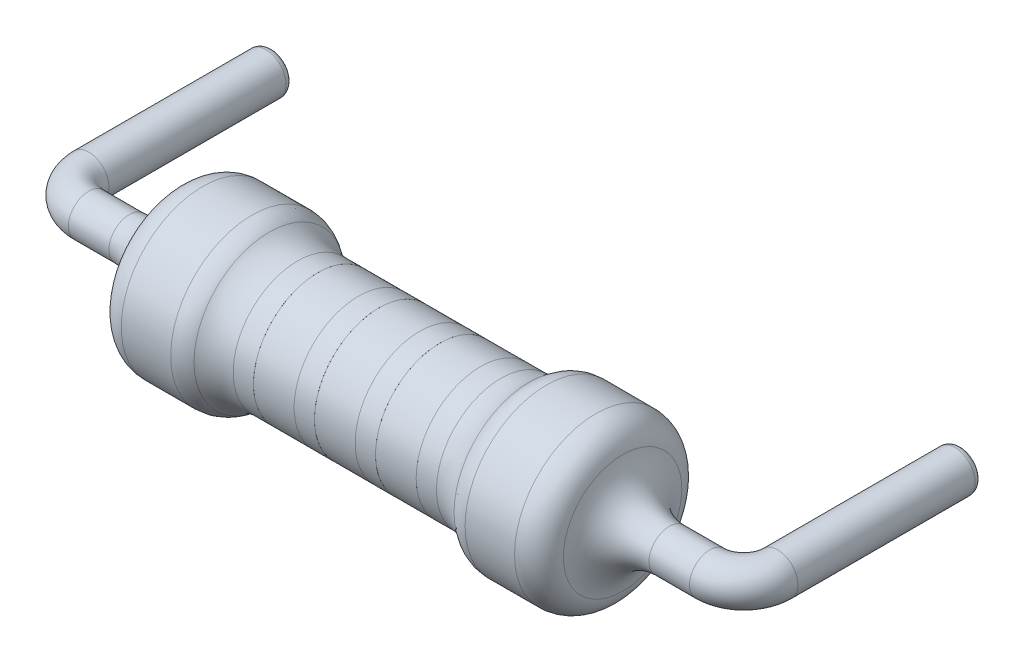
ISO-10303-21;
HEADER;
FILE_DESCRIPTION(('STEP AP214'),'2;1');
FILE_NAME('part.step','',(''),(''),'','','');
FILE_SCHEMA(('AUTOMOTIVE_DESIGN { 1 0 10303 214 1 1 1 1 }'));
ENDSEC;
DATA;
#1=APPLICATION_CONTEXT('core data for automotive mechanical design processes');
#2=APPLICATION_PROTOCOL_DEFINITION('international standard','automotive_design',2000,#1);
#3=PRODUCT_CONTEXT('',#1,'mechanical');
#4=PRODUCT('Part','Part','',(#3));
#5=PRODUCT_RELATED_PRODUCT_CATEGORY('part','',(#4));
#6=PRODUCT_DEFINITION_FORMATION('','',#4);
#7=PRODUCT_DEFINITION_CONTEXT('part definition',#1,'design');
#8=PRODUCT_DEFINITION('design','',#6,#7);
#9=PRODUCT_DEFINITION_SHAPE('','',#8);
#10=(LENGTH_UNIT() NAMED_UNIT(*) SI_UNIT(.MILLI.,.METRE.));
#11=(NAMED_UNIT(*) PLANE_ANGLE_UNIT() SI_UNIT($,.RADIAN.));
#12=(NAMED_UNIT(*) SI_UNIT($,.STERADIAN.) SOLID_ANGLE_UNIT());
#13=UNCERTAINTY_MEASURE_WITH_UNIT(LENGTH_MEASURE(1.E-05),#10,'distance_accuracy_value','');
#14=(GEOMETRIC_REPRESENTATION_CONTEXT(3) GLOBAL_UNCERTAINTY_ASSIGNED_CONTEXT((#13)) GLOBAL_UNIT_ASSIGNED_CONTEXT((#10,
#11,#12)) REPRESENTATION_CONTEXT('',''));
#15=CARTESIAN_POINT('',(0.,0.,0.));
#16=DIRECTION('',(0.,0.,1.));
#17=DIRECTION('',(1.,0.,0.));
#18=AXIS2_PLACEMENT_3D('',#15,#16,#17);
#19=CARTESIAN_POINT('',(4.48700576850888,0.,1.213));
#20=DIRECTION('',(-1.,0.,0.));
#21=DIRECTION('',(0.,0.,1.));
#22=AXIS2_PLACEMENT_3D('',#19,#20,#21);
#23=CYLINDRICAL_SURFACE('',#22,0.95);
#24=CARTESIAN_POINT('',(0.6,0.,1.213));
#25=DIRECTION('',(1.,0.,0.));
#26=DIRECTION('',(0.,0.,-1.));
#27=AXIS2_PLACEMENT_3D('',#24,#25,#26);
#28=CIRCLE('',#27,0.95);
#29=CARTESIAN_POINT('',(0.6,0.,0.262999999999996));
#30=VERTEX_POINT('',#29);
#31=EDGE_CURVE('E92',#30,#30,#28,.T.);
#32=ORIENTED_EDGE('',*,*,#31,.T.);
#33=EDGE_LOOP('',(#32));
#34=FACE_BOUND('',#33,.T.);
#35=CARTESIAN_POINT('',(1.2,0.,1.213));
#36=DIRECTION('',(1.,0.,0.));
#37=DIRECTION('',(0.,0.,-1.));
#38=AXIS2_PLACEMENT_3D('',#35,#36,#37);
#39=CIRCLE('',#38,0.95);
#40=CARTESIAN_POINT('',(1.2,0.,0.262999999999996));
#41=VERTEX_POINT('',#40);
#42=EDGE_CURVE('E67',#41,#41,#39,.T.);
#43=ORIENTED_EDGE('',*,*,#42,.F.);
#44=EDGE_LOOP('',(#43));
#45=FACE_BOUND('',#44,.T.);
#46=ADVANCED_FACE('F54',(#34,#45),#23,.T.);
#47=CARTESIAN_POINT('',(1.2,0.,1.213));
#48=DIRECTION('',(1.,0.,0.));
#49=DIRECTION('',(0.,0.,-1.));
#50=AXIS2_PLACEMENT_3D('',#47,#48,#49);
#51=PLANE('',#50);
#52=CARTESIAN_POINT('',(1.2,0.,1.213));
#53=DIRECTION('',(1.,0.,0.));
#54=DIRECTION('',(0.,0.,-1.));
#55=AXIS2_PLACEMENT_3D('',#52,#53,#54);
#56=CIRCLE('',#55,0.9505);
#57=CARTESIAN_POINT('',(1.2,0.,0.262499999999996));
#58=VERTEX_POINT('',#57);
#59=EDGE_CURVE('E96',#58,#58,#56,.T.);
#60=ORIENTED_EDGE('',*,*,#59,.F.);
#61=EDGE_LOOP('',(#60));
#62=FACE_BOUND('',#61,.T.);
#63=ORIENTED_EDGE('',*,*,#42,.T.);
#64=EDGE_LOOP('',(#63));
#65=FACE_BOUND('',#64,.T.);
#66=ADVANCED_FACE('F178',(#62,#65),#51,.F.);
#67=CARTESIAN_POINT('',(1.5,0.,1.213));
#68=DIRECTION('',(-1.,0.,0.));
#69=DIRECTION('',(0.,0.,1.));
#70=AXIS2_PLACEMENT_3D('',#67,#68,#69);
#71=CYLINDRICAL_SURFACE('',#70,0.9505);
#72=ORIENTED_EDGE('',*,*,#59,.T.);
#73=EDGE_LOOP('',(#72));
#74=FACE_BOUND('',#73,.T.);
#75=CARTESIAN_POINT('',(1.49905071029915,0.,1.213));
#76=DIRECTION('',(-1.,0.,0.));
#77=DIRECTION('',(0.,0.,1.));
#78=AXIS2_PLACEMENT_3D('',#75,#76,#77);
#79=CIRCLE('',#78,0.9505);
#80=CARTESIAN_POINT('',(1.49905071029915,0.,2.1635));
#81=VERTEX_POINT('',#80);
#82=EDGE_CURVE('E153',#81,#81,#79,.T.);
#83=ORIENTED_EDGE('',*,*,#82,.T.);
#84=EDGE_LOOP('',(#83));
#85=FACE_BOUND('',#84,.T.);
#86=ADVANCED_FACE('F185',(#74,#85),#71,.T.);
#87=CARTESIAN_POINT('',(5.08,0.,-2.00000000000004));
#88=DIRECTION('',(0.,0.,-1.));
#89=DIRECTION('',(-1.,0.,0.));
#90=AXIS2_PLACEMENT_3D('',#87,#88,#89);
#91=PLANE('',#90);
#92=CARTESIAN_POINT('',(5.08,0.,-2.00000000000004));
#93=DIRECTION('',(0.,0.,-1.));
#94=DIRECTION('',(-1.,0.,0.));
#95=AXIS2_PLACEMENT_3D('',#92,#93,#94);
#96=CIRCLE('',#95,0.2);
#97=CARTESIAN_POINT('',(4.88,0.,-2.00000000000003));
#98=VERTEX_POINT('',#97);
#99=EDGE_CURVE('E117',#98,#98,#96,.T.);
#100=ORIENTED_EDGE('',*,*,#99,.T.);
#101=EDGE_LOOP('',(#100));
#102=FACE_BOUND('',#101,.T.);
#103=ADVANCED_FACE('F241',(#102),#91,.T.);
#104=CARTESIAN_POINT('',(5.08,0.,-1.90000000000004));
#105=DIRECTION('',(0.,0.,-1.));
#106=DIRECTION('',(-1.,0.,0.));
#107=AXIS2_PLACEMENT_3D('',#104,#105,#106);
#108=TOROIDAL_SURFACE('',#107,0.2,0.1);
#109=CARTESIAN_POINT('',(5.08,0.,-1.90000000000004));
#110=DIRECTION('',(0.,0.,-1.));
#111=DIRECTION('',(-1.,0.,0.));
#112=AXIS2_PLACEMENT_3D('',#109,#110,#111);
#113=CIRCLE('',#112,0.3);
#114=CARTESIAN_POINT('',(4.78,0.,-1.90000000000003));
#115=VERTEX_POINT('',#114);
#116=EDGE_CURVE('E120',#115,#115,#113,.F.);
#117=ORIENTED_EDGE('',*,*,#116,.F.);
#118=EDGE_LOOP('',(#117));
#119=FACE_BOUND('',#118,.T.);
#120=ORIENTED_EDGE('',*,*,#99,.F.);
#121=EDGE_LOOP('',(#120));
#122=FACE_BOUND('',#121,.T.);
#123=ADVANCED_FACE('F244',(#119,#122),#108,.T.);
#124=CARTESIAN_POINT('',(5.08,0.,0.712999999999925));
#125=DIRECTION('',(0.,0.,-1.));
#126=DIRECTION('',(-1.,0.,0.));
#127=AXIS2_PLACEMENT_3D('',#124,#125,#126);
#128=CYLINDRICAL_SURFACE('',#127,0.3);
#129=ORIENTED_EDGE('',*,*,#116,.T.);
#130=EDGE_LOOP('',(#129));
#131=FACE_BOUND('',#130,.T.);
#132=CARTESIAN_POINT('',(5.08,0.,0.712999999999925));
#133=DIRECTION('',(0.,0.,-1.));
#134=DIRECTION('',(-1.,0.,0.));
#135=AXIS2_PLACEMENT_3D('',#132,#133,#134);
#136=CIRCLE('',#135,0.3);
#137=CARTESIAN_POINT('',(5.38,0.,0.712999999999883));
#138=VERTEX_POINT('',#137);
#139=EDGE_CURVE('E99',#138,#138,#136,.T.);
#140=ORIENTED_EDGE('',*,*,#139,.T.);
#141=EDGE_LOOP('',(#140));
#142=FACE_BOUND('',#141,.T.);
#143=ADVANCED_FACE('F246',(#131,#142),#128,.T.);
#144=CARTESIAN_POINT('',(4.58,0.,0.712999999999995));
#145=DIRECTION('',(0.,-1.,0.));
#146=DIRECTION('',(0.,0.,-1.));
#147=AXIS2_PLACEMENT_3D('',#144,#145,#146);
#148=TOROIDAL_SURFACE('',#147,0.5,0.3);
#149=CARTESIAN_POINT('',(4.58,0.,1.213));
#150=DIRECTION('',(1.,0.,1.33510039899901E-13));
#151=DIRECTION('',(1.33510039899901E-13,0.,-1.));
#152=AXIS2_PLACEMENT_3D('',#149,#150,#151);
#153=CIRCLE('',#152,0.3);
#154=CARTESIAN_POINT('',(4.58,0.,1.513));
#155=VERTEX_POINT('',#154);
#156=EDGE_CURVE('E102',#155,#155,#153,.T.);
#157=CARTESIAN_POINT('',(4.58,0.,0.712999999999995));
#158=DIRECTION('',(0.,-1.,0.));
#159=DIRECTION('',(0.,0.,-1.));
#160=AXIS2_PLACEMENT_3D('',#157,#158,#159);
#161=CIRCLE('',#160,0.800000000000001);
#162=EDGE_CURVE('',#138,#155,#161,.T.);
#163=ORIENTED_EDGE('',*,*,#139,.F.);
#164=ORIENTED_EDGE('',*,*,#156,.T.);
#165=ORIENTED_EDGE('',*,*,#162,.T.);
#166=ORIENTED_EDGE('',*,*,#162,.F.);
#167=EDGE_LOOP('',(#163,#165,#164,#166));
#168=FACE_BOUND('',#167,.T.);
#169=ADVANCED_FACE('F249',(#168),#148,.T.);
#170=CARTESIAN_POINT('',(4.58,0.,1.213));
#171=DIRECTION('',(-1.,0.,0.));
#172=DIRECTION('',(0.,0.,1.));
#173=AXIS2_PLACEMENT_3D('',#170,#171,#172);
#174=CYLINDRICAL_SURFACE('',#173,0.3);
#175=CARTESIAN_POINT('',(3.9816653826392,0.,1.213));
#176=DIRECTION('',(1.,0.,0.));
#177=DIRECTION('',(0.,0.,-1.));
#178=AXIS2_PLACEMENT_3D('',#175,#176,#177);
#179=CIRCLE('',#178,0.3);
#180=CARTESIAN_POINT('',(3.9816653826392,0.,0.912999999999996));
#181=VERTEX_POINT('',#180);
#182=EDGE_CURVE('E135',#181,#181,#179,.T.);
#183=ORIENTED_EDGE('',*,*,#182,.T.);
#184=EDGE_LOOP('',(#183));
#185=FACE_BOUND('',#184,.T.);
#186=ORIENTED_EDGE('',*,*,#156,.F.);
#187=EDGE_LOOP('',(#186));
#188=FACE_BOUND('',#187,.T.);
#189=ADVANCED_FACE('F253',(#185,#188),#174,.T.);
#190=CARTESIAN_POINT('',(3.9816653826392,0.,1.213));
#191=DIRECTION('',(1.,0.,0.));
#192=DIRECTION('',(0.,0.,-1.));
#193=AXIS2_PLACEMENT_3D('',#190,#191,#192);
#194=TOROIDAL_SURFACE('',#193,1.,0.7);
#195=CARTESIAN_POINT('',(3.29333286641425,0.,1.213));
#196=DIRECTION('',(-1.,0.,0.));
#197=DIRECTION('',(0.,0.,1.));
#198=AXIS2_PLACEMENT_3D('',#195,#196,#197);
#199=CIRCLE('',#198,0.872727272727272);
#200=CARTESIAN_POINT('',(3.29333286641425,0.,2.08572727272727));
#201=VERTEX_POINT('',#200);
#202=EDGE_CURVE('E138',#201,#201,#199,.T.);
#203=ORIENTED_EDGE('',*,*,#202,.F.);
#204=EDGE_LOOP('',(#203));
#205=FACE_BOUND('',#204,.T.);
#206=ORIENTED_EDGE('',*,*,#182,.F.);
#207=EDGE_LOOP('',(#206));
#208=FACE_BOUND('',#207,.T.);
#209=ADVANCED_FACE('F257',(#205,#208),#194,.F.);
#210=CARTESIAN_POINT('',(2.9,0.,1.213));
#211=DIRECTION('',(1.,0.,0.));
#212=DIRECTION('',(0.,0.,-1.));
#213=AXIS2_PLACEMENT_3D('',#210,#211,#212);
#214=TOROIDAL_SURFACE('',#213,0.8,0.4);
#215=ORIENTED_EDGE('',*,*,#202,.T.);
#216=EDGE_LOOP('',(#215));
#217=FACE_BOUND('',#216,.T.);
#218=CARTESIAN_POINT('',(2.9,0.,1.213));
#219=DIRECTION('',(1.,0.,0.));
#220=DIRECTION('',(0.,0.,-1.));
#221=AXIS2_PLACEMENT_3D('',#218,#219,#220);
#222=CIRCLE('',#221,1.2);
#223=CARTESIAN_POINT('',(2.9,0.,0.0129999999999959));
#224=VERTEX_POINT('',#223);
#225=EDGE_CURVE('E123',#224,#224,#222,.F.);
#226=ORIENTED_EDGE('',*,*,#225,.F.);
#227=EDGE_LOOP('',(#226));
#228=FACE_BOUND('',#227,.T.);
#229=ADVANCED_FACE('F279',(#217,#228),#214,.T.);
#230=CARTESIAN_POINT('',(3.3,0.,1.213));
#231=DIRECTION('',(-1.,0.,0.));
#232=DIRECTION('',(0.,0.,1.));
#233=AXIS2_PLACEMENT_3D('',#230,#231,#232);
#234=CYLINDRICAL_SURFACE('',#233,1.2);
#235=CARTESIAN_POINT('',(2.17080992435478,0.,1.213));
#236=DIRECTION('',(-1.,0.,0.));
#237=DIRECTION('',(0.,0.,1.));
#238=AXIS2_PLACEMENT_3D('',#235,#236,#237);
#239=CIRCLE('',#238,1.2);
#240=CARTESIAN_POINT('',(2.17080992435478,0.,2.413));
#241=VERTEX_POINT('',#240);
#242=EDGE_CURVE('E126',#241,#241,#239,.F.);
#243=ORIENTED_EDGE('',*,*,#242,.T.);
#244=EDGE_LOOP('',(#243));
#245=FACE_BOUND('',#244,.T.);
#246=ORIENTED_EDGE('',*,*,#225,.T.);
#247=EDGE_LOOP('',(#246));
#248=FACE_BOUND('',#247,.T.);
#249=ADVANCED_FACE('F240',(#245,#248),#234,.T.);
#250=CARTESIAN_POINT('',(2.17080992435478,0.,1.213));
#251=DIRECTION('',(-1.,0.,0.));
#252=DIRECTION('',(0.,0.,1.));
#253=AXIS2_PLACEMENT_3D('',#250,#251,#252);
#254=TOROIDAL_SURFACE('',#253,0.8,0.4);
#255=CARTESIAN_POINT('',(1.91691465083171,0.,1.213));
#256=DIRECTION('',(1.,0.,0.));
#257=DIRECTION('',(0.,0.,-1.));
#258=AXIS2_PLACEMENT_3D('',#255,#256,#257);
#259=CIRCLE('',#258,1.10909090909091);
#260=CARTESIAN_POINT('',(1.91691465083171,0.,0.103909090909087));
#261=VERTEX_POINT('',#260);
#262=EDGE_CURVE('E150',#261,#261,#259,.T.);
#263=ORIENTED_EDGE('',*,*,#262,.T.);
#264=EDGE_LOOP('',(#263));
#265=FACE_BOUND('',#264,.T.);
#266=ORIENTED_EDGE('',*,*,#242,.F.);
#267=EDGE_LOOP('',(#266));
#268=FACE_BOUND('',#267,.T.);
#269=ADVANCED_FACE('F174',(#265,#268),#254,.T.);
#270=CARTESIAN_POINT('',(1.47259792216634,0.,1.213));
#271=DIRECTION('',(-1.,0.,0.));
#272=DIRECTION('',(0.,0.,1.));
#273=AXIS2_PLACEMENT_3D('',#270,#271,#272);
#274=TOROIDAL_SURFACE('',#273,1.65,0.7);
#275=ORIENTED_EDGE('',*,*,#262,.F.);
#276=EDGE_LOOP('',(#275));
#277=FACE_BOUND('',#276,.T.);
#278=ORIENTED_EDGE('',*,*,#82,.F.);
#279=EDGE_LOOP('',(#278));
#280=FACE_BOUND('',#279,.T.);
#281=ADVANCED_FACE('F56',(#277,#280),#274,.F.);
#282=CARTESIAN_POINT('',(0.6,0.,1.213));
#283=DIRECTION('',(1.,0.,0.));
#284=DIRECTION('',(0.,0.,-1.));
#285=AXIS2_PLACEMENT_3D('',#282,#283,#284);
#286=PLANE('',#285);
#287=CARTESIAN_POINT('',(0.6,0.,1.213));
#288=DIRECTION('',(1.,0.,0.));
#289=DIRECTION('',(0.,0.,-1.));
#290=AXIS2_PLACEMENT_3D('',#287,#288,#289);
#291=CIRCLE('',#290,0.9505);
#292=CARTESIAN_POINT('',(0.6,0.,0.262499999999996));
#293=VERTEX_POINT('',#292);
#294=EDGE_CURVE('E89',#293,#293,#291,.T.);
#295=ORIENTED_EDGE('',*,*,#294,.T.);
#296=EDGE_LOOP('',(#295));
#297=FACE_BOUND('',#296,.T.);
#298=ORIENTED_EDGE('',*,*,#31,.F.);
#299=EDGE_LOOP('',(#298));
#300=FACE_BOUND('',#299,.T.);
#301=ADVANCED_FACE('F162',(#297,#300),#286,.T.);
#302=CARTESIAN_POINT('',(0.3,0.,1.213));
#303=DIRECTION('',(1.,0.,0.));
#304=DIRECTION('',(0.,0.,-1.));
#305=AXIS2_PLACEMENT_3D('',#302,#303,#304);
#306=PLANE('',#305);
#307=CARTESIAN_POINT('',(0.3,0.,1.213));
#308=DIRECTION('',(1.,0.,0.));
#309=DIRECTION('',(0.,0.,-1.));
#310=AXIS2_PLACEMENT_3D('',#307,#308,#309);
#311=CIRCLE('',#310,0.9505);
#312=CARTESIAN_POINT('',(0.3,0.,0.262499999999996));
#313=VERTEX_POINT('',#312);
#314=EDGE_CURVE('E93',#313,#313,#311,.T.);
#315=ORIENTED_EDGE('',*,*,#314,.F.);
#316=EDGE_LOOP('',(#315));
#317=FACE_BOUND('',#316,.T.);
#318=CARTESIAN_POINT('',(0.3,0.,1.213));
#319=DIRECTION('',(1.,0.,0.));
#320=DIRECTION('',(0.,0.,-1.));
#321=AXIS2_PLACEMENT_3D('',#318,#319,#320);
#322=CIRCLE('',#321,0.95);
#323=CARTESIAN_POINT('',(0.3,0.,0.262999999999996));
#324=VERTEX_POINT('',#323);
#325=EDGE_CURVE('E62',#324,#324,#322,.T.);
#326=ORIENTED_EDGE('',*,*,#325,.T.);
#327=EDGE_LOOP('',(#326));
#328=FACE_BOUND('',#327,.T.);
#329=ADVANCED_FACE('F164',(#317,#328),#306,.F.);
#330=CARTESIAN_POINT('',(0.6,0.,1.213));
#331=DIRECTION('',(-1.,0.,0.));
#332=DIRECTION('',(0.,0.,1.));
#333=AXIS2_PLACEMENT_3D('',#330,#331,#332);
#334=CYLINDRICAL_SURFACE('',#333,0.9505);
#335=ORIENTED_EDGE('',*,*,#294,.F.);
#336=EDGE_LOOP('',(#335));
#337=FACE_BOUND('',#336,.T.);
#338=ORIENTED_EDGE('',*,*,#314,.T.);
#339=EDGE_LOOP('',(#338));
#340=FACE_BOUND('',#339,.T.);
#341=ADVANCED_FACE('F171',(#337,#340),#334,.T.);
#342=CARTESIAN_POINT('',(-0.3,0.,1.213));
#343=DIRECTION('',(1.,0.,0.));
#344=DIRECTION('',(0.,0.,-1.));
#345=AXIS2_PLACEMENT_3D('',#342,#343,#344);
#346=CIRCLE('',#345,0.95);
#347=CARTESIAN_POINT('',(-0.3,0.,0.262999999999996));
#348=VERTEX_POINT('',#347);
#349=EDGE_CURVE('E70',#348,#348,#346,.T.);
#350=ORIENTED_EDGE('',*,*,#349,.T.);
#351=EDGE_LOOP('',(#350));
#352=FACE_BOUND('',#351,.T.);
#353=ORIENTED_EDGE('',*,*,#325,.F.);
#354=EDGE_LOOP('',(#353));
#355=FACE_BOUND('',#354,.T.);
#356=ADVANCED_FACE('F181',(#352,#355),#23,.T.);
#357=CARTESIAN_POINT('',(-0.6,0.,1.213));
#358=DIRECTION('',(1.,0.,0.));
#359=DIRECTION('',(0.,0.,-1.));
#360=AXIS2_PLACEMENT_3D('',#357,#358,#359);
#361=PLANE('',#360);
#362=CARTESIAN_POINT('',(-0.6,0.,1.213));
#363=DIRECTION('',(1.,0.,0.));
#364=DIRECTION('',(0.,0.,-1.));
#365=AXIS2_PLACEMENT_3D('',#362,#363,#364);
#366=CIRCLE('',#365,0.9505);
#367=CARTESIAN_POINT('',(-0.6,0.,0.262499999999996));
#368=VERTEX_POINT('',#367);
#369=EDGE_CURVE('E84',#368,#368,#366,.T.);
#370=ORIENTED_EDGE('',*,*,#369,.F.);
#371=EDGE_LOOP('',(#370));
#372=FACE_BOUND('',#371,.T.);
#373=CARTESIAN_POINT('',(-0.6,0.,1.213));
#374=DIRECTION('',(1.,0.,0.));
#375=DIRECTION('',(0.,0.,-1.));
#376=AXIS2_PLACEMENT_3D('',#373,#374,#375);
#377=CIRCLE('',#376,0.95);
#378=CARTESIAN_POINT('',(-0.6,0.,0.262999999999996));
#379=VERTEX_POINT('',#378);
#380=EDGE_CURVE('E11',#379,#379,#377,.T.);
#381=ORIENTED_EDGE('',*,*,#380,.T.);
#382=EDGE_LOOP('',(#381));
#383=FACE_BOUND('',#382,.T.);
#384=ADVANCED_FACE('F194',(#372,#383),#361,.F.);
#385=CARTESIAN_POINT('',(-0.3,0.,1.213));
#386=DIRECTION('',(1.,0.,0.));
#387=DIRECTION('',(0.,0.,-1.));
#388=AXIS2_PLACEMENT_3D('',#385,#386,#387);
#389=PLANE('',#388);
#390=CARTESIAN_POINT('',(-0.3,0.,1.213));
#391=DIRECTION('',(1.,0.,0.));
#392=DIRECTION('',(0.,0.,-1.));
#393=AXIS2_PLACEMENT_3D('',#390,#391,#392);
#394=CIRCLE('',#393,0.9505);
#395=CARTESIAN_POINT('',(-0.3,0.,0.262499999999996));
#396=VERTEX_POINT('',#395);
#397=EDGE_CURVE('E78',#396,#396,#394,.T.);
#398=ORIENTED_EDGE('',*,*,#397,.T.);
#399=EDGE_LOOP('',(#398));
#400=FACE_BOUND('',#399,.T.);
#401=ORIENTED_EDGE('',*,*,#349,.F.);
#402=EDGE_LOOP('',(#401));
#403=FACE_BOUND('',#402,.T.);
#404=ADVANCED_FACE('F200',(#400,#403),#389,.T.);
#405=CARTESIAN_POINT('',(-0.6,0.,1.213));
#406=DIRECTION('',(1.,0.,0.));
#407=DIRECTION('',(0.,0.,-1.));
#408=AXIS2_PLACEMENT_3D('',#405,#406,#407);
#409=CYLINDRICAL_SURFACE('',#408,0.9505);
#410=ORIENTED_EDGE('',*,*,#369,.T.);
#411=EDGE_LOOP('',(#410));
#412=FACE_BOUND('',#411,.T.);
#413=ORIENTED_EDGE('',*,*,#397,.F.);
#414=EDGE_LOOP('',(#413));
#415=FACE_BOUND('',#414,.T.);
#416=ADVANCED_FACE('F192',(#412,#415),#409,.T.);
#417=CARTESIAN_POINT('',(-1.2,0.,1.213));
#418=DIRECTION('',(1.,0.,0.));
#419=DIRECTION('',(0.,0.,-1.));
#420=AXIS2_PLACEMENT_3D('',#417,#418,#419);
#421=CIRCLE('',#420,0.95);
#422=CARTESIAN_POINT('',(-1.2,0.,0.262999999999996));
#423=VERTEX_POINT('',#422);
#424=EDGE_CURVE('E72',#423,#423,#421,.T.);
#425=ORIENTED_EDGE('',*,*,#424,.T.);
#426=EDGE_LOOP('',(#425));
#427=FACE_BOUND('',#426,.T.);
#428=ORIENTED_EDGE('',*,*,#380,.F.);
#429=EDGE_LOOP('',(#428));
#430=FACE_BOUND('',#429,.T.);
#431=ADVANCED_FACE('F180',(#427,#430),#23,.T.);
#432=CARTESIAN_POINT('',(-1.5,0.,1.213));
#433=DIRECTION('',(1.,0.,0.));
#434=DIRECTION('',(0.,0.,-1.));
#435=AXIS2_PLACEMENT_3D('',#432,#433,#434);
#436=CYLINDRICAL_SURFACE('',#435,0.9505);
#437=CARTESIAN_POINT('',(-1.2,0.,1.213));
#438=DIRECTION('',(1.,0.,0.));
#439=DIRECTION('',(0.,0.,-1.));
#440=AXIS2_PLACEMENT_3D('',#437,#438,#439);
#441=CIRCLE('',#440,0.9505);
#442=CARTESIAN_POINT('',(-1.2,0.,0.262499999999996));
#443=VERTEX_POINT('',#442);
#444=EDGE_CURVE('E74',#443,#443,#441,.T.);
#445=ORIENTED_EDGE('',*,*,#444,.F.);
#446=EDGE_LOOP('',(#445));
#447=FACE_BOUND('',#446,.T.);
#448=CARTESIAN_POINT('',(-1.49905071029915,0.,1.213));
#449=DIRECTION('',(1.,0.,0.));
#450=DIRECTION('',(0.,0.,-1.));
#451=AXIS2_PLACEMENT_3D('',#448,#449,#450);
#452=CIRCLE('',#451,0.9505);
#453=CARTESIAN_POINT('',(-1.49905071029915,0.,0.262499999999996));
#454=VERTEX_POINT('',#453);
#455=EDGE_CURVE('E58',#454,#454,#452,.F.);
#456=ORIENTED_EDGE('',*,*,#455,.F.);
#457=EDGE_LOOP('',(#456));
#458=FACE_BOUND('',#457,.T.);
#459=ADVANCED_FACE('F191',(#447,#458),#436,.T.);
#460=CARTESIAN_POINT('',(-1.2,0.,1.213));
#461=DIRECTION('',(1.,0.,0.));
#462=DIRECTION('',(0.,0.,-1.));
#463=AXIS2_PLACEMENT_3D('',#460,#461,#462);
#464=PLANE('',#463);
#465=ORIENTED_EDGE('',*,*,#444,.T.);
#466=EDGE_LOOP('',(#465));
#467=FACE_BOUND('',#466,.T.);
#468=ORIENTED_EDGE('',*,*,#424,.F.);
#469=EDGE_LOOP('',(#468));
#470=FACE_BOUND('',#469,.T.);
#471=ADVANCED_FACE('F221',(#467,#470),#464,.T.);
#472=CARTESIAN_POINT('',(-5.08,0.,-1.99999999999996));
#473=DIRECTION('',(-1.33226762955019E-13,0.,1.));
#474=DIRECTION('',(1.,0.,1.33226762955019E-13));
#475=AXIS2_PLACEMENT_3D('',#472,#473,#474);
#476=PLANE('',#475);
#477=CARTESIAN_POINT('',(-5.07999999999999,0.,-1.99999999999996));
#478=DIRECTION('',(-1.33226762955019E-13,0.,1.));
#479=DIRECTION('',(1.,0.,1.33226762955019E-13));
#480=AXIS2_PLACEMENT_3D('',#477,#478,#479);
#481=CIRCLE('',#480,0.2);
#482=CARTESIAN_POINT('',(-4.87999999999999,0.,-1.99999999999994));
#483=VERTEX_POINT('',#482);
#484=EDGE_CURVE('E114',#483,#483,#481,.F.);
#485=ORIENTED_EDGE('',*,*,#484,.T.);
#486=EDGE_LOOP('',(#485));
#487=FACE_BOUND('',#486,.T.);
#488=ADVANCED_FACE('F224',(#487),#476,.F.);
#489=CARTESIAN_POINT('',(-5.08,0.,-1.89999999999997));
#490=DIRECTION('',(-1.33226762955019E-13,0.,1.));
#491=DIRECTION('',(1.,0.,1.33226762955019E-13));
#492=AXIS2_PLACEMENT_3D('',#489,#490,#491);
#493=TOROIDAL_SURFACE('',#492,0.2,0.1);
#494=ORIENTED_EDGE('',*,*,#484,.F.);
#495=EDGE_LOOP('',(#494));
#496=FACE_BOUND('',#495,.T.);
#497=CARTESIAN_POINT('',(-5.08,0.,-1.89999999999998));
#498=DIRECTION('',(-1.33226762955019E-13,0.,1.));
#499=DIRECTION('',(1.,0.,1.33226762955019E-13));
#500=AXIS2_PLACEMENT_3D('',#497,#498,#499);
#501=CIRCLE('',#500,0.3);
#502=CARTESIAN_POINT('',(-4.78,0.,-1.89999999999994));
#503=VERTEX_POINT('',#502);
#504=EDGE_CURVE('E111',#503,#503,#501,.T.);
#505=ORIENTED_EDGE('',*,*,#504,.F.);
#506=EDGE_LOOP('',(#505));
#507=FACE_BOUND('',#506,.T.);
#508=ADVANCED_FACE('F228',(#496,#507),#493,.T.);
#509=CARTESIAN_POINT('',(-5.08,0.,0.712999999999996));
#510=DIRECTION('',(0.,0.,-1.));
#511=DIRECTION('',(-1.,0.,0.));
#512=AXIS2_PLACEMENT_3D('',#509,#510,#511);
#513=CYLINDRICAL_SURFACE('',#512,0.3);
#514=ORIENTED_EDGE('',*,*,#504,.T.);
#515=EDGE_LOOP('',(#514));
#516=FACE_BOUND('',#515,.T.);
#517=CARTESIAN_POINT('',(-5.08,0.,0.712999999999996));
#518=DIRECTION('',(-1.33226762955019E-13,0.,1.));
#519=DIRECTION('',(1.,0.,1.33226762955019E-13));
#520=AXIS2_PLACEMENT_3D('',#517,#518,#519);
#521=CIRCLE('',#520,0.3);
#522=CARTESIAN_POINT('',(-5.38,0.,0.712999999999996));
#523=VERTEX_POINT('',#522);
#524=EDGE_CURVE('E108',#523,#523,#521,.T.);
#525=ORIENTED_EDGE('',*,*,#524,.F.);
#526=EDGE_LOOP('',(#525));
#527=FACE_BOUND('',#526,.T.);
#528=ADVANCED_FACE('F235',(#516,#527),#513,.T.);
#529=CARTESIAN_POINT('',(-4.58,0.,0.712999999999996));
#530=DIRECTION('',(0.,-1.,0.));
#531=DIRECTION('',(0.,0.,-1.));
#532=AXIS2_PLACEMENT_3D('',#529,#530,#531);
#533=TOROIDAL_SURFACE('',#532,0.500000000000001,0.3);
#534=CARTESIAN_POINT('',(-4.58,0.,1.213));
#535=DIRECTION('',(1.,0.,1.33510039899901E-13));
#536=DIRECTION('',(1.33510039899901E-13,0.,-1.));
#537=AXIS2_PLACEMENT_3D('',#534,#535,#536);
#538=CIRCLE('',#537,0.3);
#539=CARTESIAN_POINT('',(-4.58,0.,1.513));
#540=VERTEX_POINT('',#539);
#541=EDGE_CURVE('E105',#540,#540,#538,.T.);
#542=CARTESIAN_POINT('',(-4.58,0.,0.712999999999996));
#543=DIRECTION('',(0.,-1.,0.));
#544=DIRECTION('',(0.,0.,-1.));
#545=AXIS2_PLACEMENT_3D('',#542,#543,#544);
#546=CIRCLE('',#545,0.800000000000001);
#547=EDGE_CURVE('',#540,#523,#546,.T.);
#548=ORIENTED_EDGE('',*,*,#541,.F.);
#549=ORIENTED_EDGE('',*,*,#524,.T.);
#550=ORIENTED_EDGE('',*,*,#547,.T.);
#551=ORIENTED_EDGE('',*,*,#547,.F.);
#552=EDGE_LOOP('',(#548,#550,#549,#551));
#553=FACE_BOUND('',#552,.T.);
#554=ADVANCED_FACE('F260',(#553),#533,.T.);
#555=CARTESIAN_POINT('',(-3.9816653826392,0.,1.213));
#556=DIRECTION('',(1.,0.,0.));
#557=DIRECTION('',(0.,0.,-1.));
#558=AXIS2_PLACEMENT_3D('',#555,#556,#557);
#559=CIRCLE('',#558,0.3);
#560=CARTESIAN_POINT('',(-3.9816653826392,0.,0.912999999999996));
#561=VERTEX_POINT('',#560);
#562=EDGE_CURVE('E144',#561,#561,#559,.F.);
#563=ORIENTED_EDGE('',*,*,#562,.T.);
#564=EDGE_LOOP('',(#563));
#565=FACE_BOUND('',#564,.T.);
#566=ORIENTED_EDGE('',*,*,#541,.T.);
#567=EDGE_LOOP('',(#566));
#568=FACE_BOUND('',#567,.T.);
#569=ADVANCED_FACE('F259',(#565,#568),#174,.T.);
#570=CARTESIAN_POINT('',(-3.9816653826392,0.,1.213));
#571=DIRECTION('',(1.,0.,0.));
#572=DIRECTION('',(0.,0.,-1.));
#573=AXIS2_PLACEMENT_3D('',#570,#571,#572);
#574=TOROIDAL_SURFACE('',#573,1.,0.7);
#575=ORIENTED_EDGE('',*,*,#562,.F.);
#576=EDGE_LOOP('',(#575));
#577=FACE_BOUND('',#576,.T.);
#578=CARTESIAN_POINT('',(-3.29333286641425,0.,1.213));
#579=DIRECTION('',(1.,0.,0.));
#580=DIRECTION('',(0.,0.,-1.));
#581=AXIS2_PLACEMENT_3D('',#578,#579,#580);
#582=CIRCLE('',#581,0.872727272727273);
#583=CARTESIAN_POINT('',(-3.29333286641425,0.,0.340272727272723));
#584=VERTEX_POINT('',#583);
#585=EDGE_CURVE('E141',#584,#584,#582,.T.);
#586=ORIENTED_EDGE('',*,*,#585,.F.);
#587=EDGE_LOOP('',(#586));
#588=FACE_BOUND('',#587,.T.);
#589=ADVANCED_FACE('F286',(#577,#588),#574,.F.);
#590=CARTESIAN_POINT('',(-2.9,0.,1.213));
#591=DIRECTION('',(1.,0.,0.));
#592=DIRECTION('',(0.,0.,-1.));
#593=AXIS2_PLACEMENT_3D('',#590,#591,#592);
#594=TOROIDAL_SURFACE('',#593,0.8,0.4);
#595=ORIENTED_EDGE('',*,*,#585,.T.);
#596=EDGE_LOOP('',(#595));
#597=FACE_BOUND('',#596,.T.);
#598=CARTESIAN_POINT('',(-2.9,0.,1.213));
#599=DIRECTION('',(1.,0.,0.));
#600=DIRECTION('',(0.,0.,-1.));
#601=AXIS2_PLACEMENT_3D('',#598,#599,#600);
#602=CIRCLE('',#601,1.2);
#603=CARTESIAN_POINT('',(-2.9,0.,0.0129999999999959));
#604=VERTEX_POINT('',#603);
#605=EDGE_CURVE('E129',#604,#604,#602,.T.);
#606=ORIENTED_EDGE('',*,*,#605,.F.);
#607=EDGE_LOOP('',(#606));
#608=FACE_BOUND('',#607,.T.);
#609=ADVANCED_FACE('F283',(#597,#608),#594,.T.);
#610=CARTESIAN_POINT('',(-3.3,0.,1.213));
#611=DIRECTION('',(1.,0.,0.));
#612=DIRECTION('',(0.,0.,-1.));
#613=AXIS2_PLACEMENT_3D('',#610,#611,#612);
#614=CYLINDRICAL_SURFACE('',#613,1.2);
#615=CARTESIAN_POINT('',(-2.17080992435478,0.,1.213));
#616=DIRECTION('',(1.,0.,0.));
#617=DIRECTION('',(0.,0.,-1.));
#618=AXIS2_PLACEMENT_3D('',#615,#616,#617);
#619=CIRCLE('',#618,1.2);
#620=CARTESIAN_POINT('',(-2.17080992435478,0.,0.0129999999999959));
#621=VERTEX_POINT('',#620);
#622=EDGE_CURVE('E132',#621,#621,#619,.F.);
#623=ORIENTED_EDGE('',*,*,#622,.T.);
#624=EDGE_LOOP('',(#623));
#625=FACE_BOUND('',#624,.T.);
#626=ORIENTED_EDGE('',*,*,#605,.T.);
#627=EDGE_LOOP('',(#626));
#628=FACE_BOUND('',#627,.T.);
#629=ADVANCED_FACE('F277',(#625,#628),#614,.T.);
#630=CARTESIAN_POINT('',(-2.17080992435478,0.,1.213));
#631=DIRECTION('',(1.,0.,0.));
#632=DIRECTION('',(0.,0.,-1.));
#633=AXIS2_PLACEMENT_3D('',#630,#631,#632);
#634=TOROIDAL_SURFACE('',#633,0.8,0.4);
#635=CARTESIAN_POINT('',(-1.91691465083171,0.,1.213));
#636=DIRECTION('',(-1.,0.,0.));
#637=DIRECTION('',(0.,0.,1.));
#638=AXIS2_PLACEMENT_3D('',#635,#636,#637);
#639=CIRCLE('',#638,1.10909090909091);
#640=CARTESIAN_POINT('',(-1.91691465083171,0.,2.3220909090909));
#641=VERTEX_POINT('',#640);
#642=EDGE_CURVE('E147',#641,#641,#639,.T.);
#643=ORIENTED_EDGE('',*,*,#642,.T.);
#644=EDGE_LOOP('',(#643));
#645=FACE_BOUND('',#644,.T.);
#646=ORIENTED_EDGE('',*,*,#622,.F.);
#647=EDGE_LOOP('',(#646));
#648=FACE_BOUND('',#647,.T.);
#649=ADVANCED_FACE('F273',(#645,#648),#634,.T.);
#650=CARTESIAN_POINT('',(-1.47259792216634,0.,1.213));
#651=DIRECTION('',(-1.,0.,0.));
#652=DIRECTION('',(0.,0.,1.));
#653=AXIS2_PLACEMENT_3D('',#650,#651,#652);
#654=TOROIDAL_SURFACE('',#653,1.65,0.7);
#655=ORIENTED_EDGE('',*,*,#455,.T.);
#656=EDGE_LOOP('',(#655));
#657=FACE_BOUND('',#656,.T.);
#658=ORIENTED_EDGE('',*,*,#642,.F.);
#659=EDGE_LOOP('',(#658));
#660=FACE_BOUND('',#659,.T.);
#661=ADVANCED_FACE('F276',(#657,#660),#654,.F.);
#662=CLOSED_SHELL('',(#46,#66,#86,#103,#123,#143,#169,#189,#209,#229,#249,#269,#281,#301,#329,
#341,#356,#384,#404,#416,#431,#459,#471,#488,#508,#528,#554,#569,#589,#609,#629,#649,#661));
#663=MANIFOLD_SOLID_BREP('B2',#662);
#664=ADVANCED_BREP_SHAPE_REPRESENTATION('',(#18,#663),#14);
#665=SHAPE_DEFINITION_REPRESENTATION(#9,#664);
ENDSEC;
END-ISO-10303-21;
